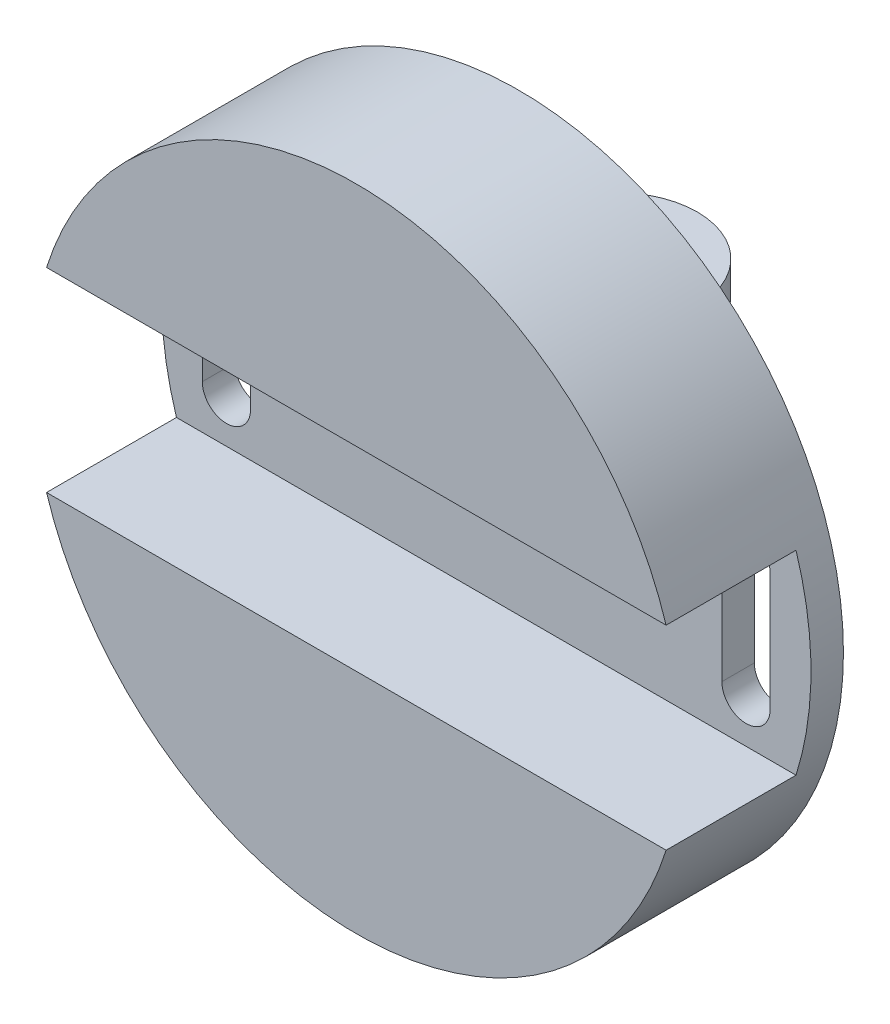
ISO-10303-21;
HEADER;
FILE_DESCRIPTION(('STEP AP214'),'2;1');
FILE_NAME('part.step','',(''),(''),'','','');
FILE_SCHEMA(('AUTOMOTIVE_DESIGN { 1 0 10303 214 1 1 1 1 }'));
ENDSEC;
DATA;
#1=APPLICATION_CONTEXT('core data for automotive mechanical design processes');
#2=APPLICATION_PROTOCOL_DEFINITION('international standard','automotive_design',2000,#1);
#3=PRODUCT_CONTEXT('',#1,'mechanical');
#4=PRODUCT('Part','Part','',(#3));
#5=PRODUCT_RELATED_PRODUCT_CATEGORY('part','',(#4));
#6=PRODUCT_DEFINITION_FORMATION('','',#4);
#7=PRODUCT_DEFINITION_CONTEXT('part definition',#1,'design');
#8=PRODUCT_DEFINITION('design','',#6,#7);
#9=PRODUCT_DEFINITION_SHAPE('','',#8);
#10=(LENGTH_UNIT() NAMED_UNIT(*) SI_UNIT(.MILLI.,.METRE.));
#11=(NAMED_UNIT(*) PLANE_ANGLE_UNIT() SI_UNIT($,.RADIAN.));
#12=(NAMED_UNIT(*) SI_UNIT($,.STERADIAN.) SOLID_ANGLE_UNIT());
#13=UNCERTAINTY_MEASURE_WITH_UNIT(LENGTH_MEASURE(1.E-05),#10,'distance_accuracy_value','');
#14=(GEOMETRIC_REPRESENTATION_CONTEXT(3) GLOBAL_UNCERTAINTY_ASSIGNED_CONTEXT((#13)) GLOBAL_UNIT_ASSIGNED_CONTEXT((#10,
#11,#12)) REPRESENTATION_CONTEXT('',''));
#15=CARTESIAN_POINT('',(0.,0.,0.));
#16=DIRECTION('',(0.,0.,1.));
#17=DIRECTION('',(1.,0.,0.));
#18=AXIS2_PLACEMENT_3D('',#15,#16,#17);
#19=CARTESIAN_POINT('',(0.,0.,25.));
#20=DIRECTION('',(0.,0.,1.));
#21=DIRECTION('',(1.,0.,0.));
#22=AXIS2_PLACEMENT_3D('',#19,#20,#21);
#23=PLANE('',#22);
#24=DIRECTION('',(-1.,0.,0.));
#25=VECTOR('',#24,1.);
#26=CARTESIAN_POINT('',(0.,15.,25.));
#27=LINE('',#26,#25);
#28=CARTESIAN_POINT('',(47.6969600708473,15.,25.));
#29=VERTEX_POINT('',#28);
#30=CARTESIAN_POINT('',(-47.6969600708473,15.,25.));
#31=VERTEX_POINT('',#30);
#32=EDGE_CURVE('E379',#29,#31,#27,.T.);
#33=ORIENTED_EDGE('',*,*,#32,.F.);
#34=CARTESIAN_POINT('',(0.,0.,25.));
#35=DIRECTION('',(0.,0.,1.));
#36=DIRECTION('',(1.,0.,0.));
#37=AXIS2_PLACEMENT_3D('',#34,#35,#36);
#38=CIRCLE('',#37,50.);
#39=EDGE_CURVE('E380',#29,#31,#38,.T.);
#40=ORIENTED_EDGE('',*,*,#39,.T.);
#41=EDGE_LOOP('',(#33,#40));
#42=FACE_BOUND('',#41,.T.);
#43=ADVANCED_FACE('F33',(#42),#23,.T.);
#44=CARTESIAN_POINT('',(0.,0.,0.));
#45=DIRECTION('',(0.,0.,1.));
#46=DIRECTION('',(1.,0.,0.));
#47=AXIS2_PLACEMENT_3D('',#44,#45,#46);
#48=PLANE('',#47);
#49=DIRECTION('',(0.,1.,0.));
#50=VECTOR('',#49,1.);
#51=CARTESIAN_POINT('',(43.7178376318911,0.,0.));
#52=LINE('',#51,#50);
#53=CARTESIAN_POINT('',(43.7178376318911,-8.23235475633024,0.));
#54=VERTEX_POINT('',#53);
#55=CARTESIAN_POINT('',(43.7178376318911,9.95849365685101,0.));
#56=VERTEX_POINT('',#55);
#57=EDGE_CURVE('E248',#54,#56,#52,.T.);
#58=ORIENTED_EDGE('',*,*,#57,.T.);
#59=CARTESIAN_POINT('',(40.,9.95849365685101,0.));
#60=DIRECTION('',(0.,0.,1.));
#61=DIRECTION('',(1.,0.,0.));
#62=AXIS2_PLACEMENT_3D('',#59,#60,#61);
#63=CIRCLE('',#62,3.71783763189105);
#64=CARTESIAN_POINT('',(36.2821623681089,9.95849365685101,0.));
#65=VERTEX_POINT('',#64);
#66=EDGE_CURVE('E251',#56,#65,#63,.T.);
#67=ORIENTED_EDGE('',*,*,#66,.T.);
#68=DIRECTION('',(0.,-1.,0.));
#69=VECTOR('',#68,1.);
#70=CARTESIAN_POINT('',(36.2821623681089,0.,0.));
#71=LINE('',#70,#69);
#72=CARTESIAN_POINT('',(36.2821623681089,-8.23235475633024,0.));
#73=VERTEX_POINT('',#72);
#74=EDGE_CURVE('E243',#65,#73,#71,.T.);
#75=ORIENTED_EDGE('',*,*,#74,.T.);
#76=CARTESIAN_POINT('',(40.,-8.23235475633024,0.));
#77=DIRECTION('',(0.,0.,1.));
#78=DIRECTION('',(1.,0.,0.));
#79=AXIS2_PLACEMENT_3D('',#76,#77,#78);
#80=CIRCLE('',#79,3.71783763189105);
#81=EDGE_CURVE('E223',#73,#54,#80,.T.);
#82=ORIENTED_EDGE('',*,*,#81,.T.);
#83=EDGE_LOOP('',(#58,#67,#75,#82));
#84=FACE_BOUND('',#83,.T.);
#85=DIRECTION('',(0.,1.,0.));
#86=VECTOR('',#85,1.);
#87=CARTESIAN_POINT('',(-36.2821623681089,0.,0.));
#88=LINE('',#87,#86);
#89=CARTESIAN_POINT('',(-36.2821623681089,-8.23235475633024,0.));
#90=VERTEX_POINT('',#89);
#91=CARTESIAN_POINT('',(-36.2821623681089,9.95849365685101,0.));
#92=VERTEX_POINT('',#91);
#93=EDGE_CURVE('E280',#90,#92,#88,.T.);
#94=ORIENTED_EDGE('',*,*,#93,.T.);
#95=CARTESIAN_POINT('',(-40.,9.95849365685101,0.));
#96=DIRECTION('',(0.,0.,1.));
#97=DIRECTION('',(1.,0.,0.));
#98=AXIS2_PLACEMENT_3D('',#95,#96,#97);
#99=CIRCLE('',#98,3.71783763189105);
#100=CARTESIAN_POINT('',(-43.7178376318911,9.95849365685101,0.));
#101=VERTEX_POINT('',#100);
#102=EDGE_CURVE('E283',#92,#101,#99,.T.);
#103=ORIENTED_EDGE('',*,*,#102,.T.);
#104=DIRECTION('',(0.,-1.,0.));
#105=VECTOR('',#104,1.);
#106=CARTESIAN_POINT('',(-43.7178376318911,0.,0.));
#107=LINE('',#106,#105);
#108=CARTESIAN_POINT('',(-43.7178376318911,-8.23235475633024,0.));
#109=VERTEX_POINT('',#108);
#110=EDGE_CURVE('E268',#101,#109,#107,.T.);
#111=ORIENTED_EDGE('',*,*,#110,.T.);
#112=CARTESIAN_POINT('',(-40.,-8.23235475633024,0.));
#113=DIRECTION('',(0.,0.,1.));
#114=DIRECTION('',(1.,0.,0.));
#115=AXIS2_PLACEMENT_3D('',#112,#113,#114);
#116=CIRCLE('',#115,3.71783763189105);
#117=EDGE_CURVE('E277',#109,#90,#116,.T.);
#118=ORIENTED_EDGE('',*,*,#117,.T.);
#119=EDGE_LOOP('',(#94,#103,#111,#118));
#120=FACE_BOUND('',#119,.T.);
#121=DIRECTION('',(0.,-1.,0.));
#122=VECTOR('',#121,1.);
#123=CARTESIAN_POINT('',(12.5,20.,0.));
#124=LINE('',#123,#122);
#125=CARTESIAN_POINT('',(12.5,20.,0.));
#126=VERTEX_POINT('',#125);
#127=CARTESIAN_POINT('',(12.5,15.,0.));
#128=VERTEX_POINT('',#127);
#129=EDGE_CURVE('E349',#126,#128,#124,.T.);
#130=ORIENTED_EDGE('',*,*,#129,.F.);
#131=DIRECTION('',(-1.,0.,0.));
#132=VECTOR('',#131,1.);
#133=CARTESIAN_POINT('',(25.,20.,0.));
#134=LINE('',#133,#132);
#135=CARTESIAN_POINT('',(25.,20.,0.));
#136=VERTEX_POINT('',#135);
#137=EDGE_CURVE('E405',#136,#126,#134,.T.);
#138=ORIENTED_EDGE('',*,*,#137,.F.);
#139=DIRECTION('',(0.,-1.,0.));
#140=VECTOR('',#139,1.);
#141=CARTESIAN_POINT('',(25.,40.,0.));
#142=LINE('',#141,#140);
#143=CARTESIAN_POINT('',(25.,40.,0.));
#144=VERTEX_POINT('',#143);
#145=EDGE_CURVE('E415',#144,#136,#142,.T.);
#146=ORIENTED_EDGE('',*,*,#145,.F.);
#147=DIRECTION('',(1.,0.,0.));
#148=VECTOR('',#147,1.);
#149=CARTESIAN_POINT('',(25.,40.,0.));
#150=LINE('',#149,#148);
#151=CARTESIAN_POINT('',(-25.,40.,0.));
#152=VERTEX_POINT('',#151);
#153=EDGE_CURVE('E420',#152,#144,#150,.T.);
#154=ORIENTED_EDGE('',*,*,#153,.F.);
#155=DIRECTION('',(0.,1.,0.));
#156=VECTOR('',#155,1.);
#157=CARTESIAN_POINT('',(-25.,40.,0.));
#158=LINE('',#157,#156);
#159=CARTESIAN_POINT('',(-25.,20.,0.));
#160=VERTEX_POINT('',#159);
#161=EDGE_CURVE('E409',#160,#152,#158,.T.);
#162=ORIENTED_EDGE('',*,*,#161,.F.);
#163=CARTESIAN_POINT('',(-12.5,20.,0.));
#164=VERTEX_POINT('',#163);
#165=EDGE_CURVE('E410',#164,#160,#134,.T.);
#166=ORIENTED_EDGE('',*,*,#165,.F.);
#167=DIRECTION('',(0.,1.,0.));
#168=VECTOR('',#167,1.);
#169=CARTESIAN_POINT('',(-12.5,20.,0.));
#170=LINE('',#169,#168);
#171=CARTESIAN_POINT('',(-12.5,15.,0.));
#172=VERTEX_POINT('',#171);
#173=EDGE_CURVE('E354',#172,#164,#170,.T.);
#174=ORIENTED_EDGE('',*,*,#173,.F.);
#175=DIRECTION('',(-1.,0.,0.));
#176=VECTOR('',#175,1.);
#177=CARTESIAN_POINT('',(12.5,15.,0.));
#178=LINE('',#177,#176);
#179=EDGE_CURVE('E358',#128,#172,#178,.T.);
#180=ORIENTED_EDGE('',*,*,#179,.F.);
#181=EDGE_LOOP('',(#130,#138,#146,#154,#162,#166,#174,#180));
#182=FACE_BOUND('',#181,.T.);
#183=CARTESIAN_POINT('',(0.,0.,0.));
#184=DIRECTION('',(0.,0.,1.));
#185=DIRECTION('',(1.,0.,0.));
#186=AXIS2_PLACEMENT_3D('',#183,#184,#185);
#187=CIRCLE('',#186,50.);
#188=CARTESIAN_POINT('',(50.,0.,0.));
#189=VERTEX_POINT('',#188);
#190=EDGE_CURVE('E397',#189,#189,#187,.T.);
#191=ORIENTED_EDGE('',*,*,#190,.F.);
#192=EDGE_LOOP('',(#191));
#193=FACE_BOUND('',#192,.T.);
#194=DIRECTION('',(0.,1.,0.));
#195=VECTOR('',#194,1.);
#196=CARTESIAN_POINT('',(-12.4999999999999,-20.,0.));
#197=LINE('',#196,#195);
#198=CARTESIAN_POINT('',(-12.4999999999999,-20.,0.));
#199=VERTEX_POINT('',#198);
#200=CARTESIAN_POINT('',(-12.4999999999999,-15.,0.));
#201=VERTEX_POINT('',#200);
#202=EDGE_CURVE('E324',#199,#201,#197,.T.);
#203=ORIENTED_EDGE('',*,*,#202,.F.);
#204=DIRECTION('',(1.,0.,0.));
#205=VECTOR('',#204,1.);
#206=CARTESIAN_POINT('',(25.,-20.,0.));
#207=LINE('',#206,#205);
#208=CARTESIAN_POINT('',(-25.,-20.,0.));
#209=VERTEX_POINT('',#208);
#210=EDGE_CURVE('E459',#209,#199,#207,.T.);
#211=ORIENTED_EDGE('',*,*,#210,.F.);
#212=DIRECTION('',(0.,1.,0.));
#213=VECTOR('',#212,1.);
#214=CARTESIAN_POINT('',(-25.,-40.,0.));
#215=LINE('',#214,#213);
#216=CARTESIAN_POINT('',(-25.,-40.,0.));
#217=VERTEX_POINT('',#216);
#218=EDGE_CURVE('E464',#217,#209,#215,.T.);
#219=ORIENTED_EDGE('',*,*,#218,.F.);
#220=DIRECTION('',(-1.,0.,0.));
#221=VECTOR('',#220,1.);
#222=CARTESIAN_POINT('',(25.,-40.,0.));
#223=LINE('',#222,#221);
#224=CARTESIAN_POINT('',(25.,-40.,0.));
#225=VERTEX_POINT('',#224);
#226=EDGE_CURVE('E467',#225,#217,#223,.T.);
#227=ORIENTED_EDGE('',*,*,#226,.F.);
#228=DIRECTION('',(0.,-1.,0.));
#229=VECTOR('',#228,1.);
#230=CARTESIAN_POINT('',(25.,-40.,0.));
#231=LINE('',#230,#229);
#232=CARTESIAN_POINT('',(25.,-20.,0.));
#233=VERTEX_POINT('',#232);
#234=EDGE_CURVE('E470',#233,#225,#231,.T.);
#235=ORIENTED_EDGE('',*,*,#234,.F.);
#236=CARTESIAN_POINT('',(12.5,-20.,0.));
#237=VERTEX_POINT('',#236);
#238=EDGE_CURVE('E463',#237,#233,#207,.T.);
#239=ORIENTED_EDGE('',*,*,#238,.F.);
#240=DIRECTION('',(0.,-1.,0.));
#241=VECTOR('',#240,1.);
#242=CARTESIAN_POINT('',(12.5,-20.,0.));
#243=LINE('',#242,#241);
#244=CARTESIAN_POINT('',(12.5,-15.,0.));
#245=VERTEX_POINT('',#244);
#246=EDGE_CURVE('E331',#245,#237,#243,.T.);
#247=ORIENTED_EDGE('',*,*,#246,.F.);
#248=DIRECTION('',(1.,0.,0.));
#249=VECTOR('',#248,1.);
#250=CARTESIAN_POINT('',(12.5,-15.,0.));
#251=LINE('',#250,#249);
#252=EDGE_CURVE('E336',#201,#245,#251,.T.);
#253=ORIENTED_EDGE('',*,*,#252,.F.);
#254=EDGE_LOOP('',(#203,#211,#219,#227,#235,#239,#247,#253));
#255=FACE_BOUND('',#254,.T.);
#256=ADVANCED_FACE('F492',(#84,#120,#182,#193,#255),#48,.F.);
#257=CARTESIAN_POINT('',(0.,0.,25.));
#258=DIRECTION('',(0.,0.,-1.));
#259=DIRECTION('',(-1.,0.,0.));
#260=AXIS2_PLACEMENT_3D('',#257,#258,#259);
#261=CYLINDRICAL_SURFACE('',#260,50.);
#262=CARTESIAN_POINT('',(0.,0.,5.));
#263=DIRECTION('',(0.,0.,1.));
#264=DIRECTION('',(1.,0.,0.));
#265=AXIS2_PLACEMENT_3D('',#262,#263,#264);
#266=CIRCLE('',#265,50.);
#267=CARTESIAN_POINT('',(-47.6969600708473,15.,5.));
#268=VERTEX_POINT('',#267);
#269=CARTESIAN_POINT('',(-47.6969600708473,-15.,5.));
#270=VERTEX_POINT('',#269);
#271=EDGE_CURVE('E11',#268,#270,#266,.T.);
#272=ORIENTED_EDGE('',*,*,#271,.F.);
#273=DIRECTION('',(0.,0.,-1.));
#274=VECTOR('',#273,1.);
#275=CARTESIAN_POINT('',(-47.6969600708473,15.,25.));
#276=LINE('',#275,#274);
#277=EDGE_CURVE('E298',#268,#31,#276,.F.);
#278=ORIENTED_EDGE('',*,*,#277,.T.);
#279=ORIENTED_EDGE('',*,*,#39,.F.);
#280=DIRECTION('',(0.,0.,-1.));
#281=VECTOR('',#280,1.);
#282=CARTESIAN_POINT('',(47.6969600708473,15.,25.));
#283=LINE('',#282,#281);
#284=CARTESIAN_POINT('',(47.6969600708473,15.,5.));
#285=VERTEX_POINT('',#284);
#286=EDGE_CURVE('E301',#29,#285,#283,.T.);
#287=ORIENTED_EDGE('',*,*,#286,.T.);
#288=CARTESIAN_POINT('',(47.6969600708473,-15.,5.));
#289=VERTEX_POINT('',#288);
#290=EDGE_CURVE('E37',#289,#285,#266,.T.);
#291=ORIENTED_EDGE('',*,*,#290,.F.);
#292=DIRECTION('',(0.,0.,-1.));
#293=VECTOR('',#292,1.);
#294=CARTESIAN_POINT('',(47.6969600708473,-15.,25.));
#295=LINE('',#294,#293);
#296=CARTESIAN_POINT('',(47.6969600708473,-15.,25.));
#297=VERTEX_POINT('',#296);
#298=EDGE_CURVE('E292',#289,#297,#295,.F.);
#299=ORIENTED_EDGE('',*,*,#298,.T.);
#300=CARTESIAN_POINT('',(-47.6969600708473,-15.,25.));
#301=VERTEX_POINT('',#300);
#302=EDGE_CURVE('E394',#301,#297,#38,.T.);
#303=ORIENTED_EDGE('',*,*,#302,.F.);
#304=DIRECTION('',(0.,0.,-1.));
#305=VECTOR('',#304,1.);
#306=CARTESIAN_POINT('',(-47.6969600708473,-15.,25.));
#307=LINE('',#306,#305);
#308=EDGE_CURVE('E295',#301,#270,#307,.T.);
#309=ORIENTED_EDGE('',*,*,#308,.T.);
#310=EDGE_LOOP('',(#272,#278,#279,#287,#291,#299,#303,#309));
#311=FACE_BOUND('',#310,.T.);
#312=ORIENTED_EDGE('',*,*,#190,.T.);
#313=EDGE_LOOP('',(#312));
#314=FACE_BOUND('',#313,.T.);
#315=ADVANCED_FACE('F35',(#311,#314),#261,.T.);
#316=DIRECTION('',(1.,0.,0.));
#317=VECTOR('',#316,1.);
#318=CARTESIAN_POINT('',(0.,-15.,25.));
#319=LINE('',#318,#317);
#320=EDGE_CURVE('E378',#301,#297,#319,.T.);
#321=ORIENTED_EDGE('',*,*,#320,.F.);
#322=ORIENTED_EDGE('',*,*,#302,.T.);
#323=EDGE_LOOP('',(#321,#322));
#324=FACE_BOUND('',#323,.T.);
#325=ADVANCED_FACE('F525',(#324),#23,.T.);
#326=CARTESIAN_POINT('',(25.,40.,20.));
#327=DIRECTION('',(1.,0.,0.));
#328=DIRECTION('',(0.,1.,0.));
#329=AXIS2_PLACEMENT_3D('',#326,#327,#328);
#330=PLANE('',#329);
#331=ORIENTED_EDGE('',*,*,#145,.T.);
#332=DIRECTION('',(0.,0.,-1.));
#333=VECTOR('',#332,1.);
#334=CARTESIAN_POINT('',(25.,20.,20.));
#335=LINE('',#334,#333);
#336=CARTESIAN_POINT('',(25.,20.,20.));
#337=VERTEX_POINT('',#336);
#338=EDGE_CURVE('E400',#337,#136,#335,.T.);
#339=ORIENTED_EDGE('',*,*,#338,.F.);
#340=DIRECTION('',(0.,-1.,0.));
#341=VECTOR('',#340,1.);
#342=CARTESIAN_POINT('',(25.,40.,20.));
#343=LINE('',#342,#341);
#344=CARTESIAN_POINT('',(25.,40.,20.));
#345=VERTEX_POINT('',#344);
#346=EDGE_CURVE('E423',#345,#337,#343,.T.);
#347=ORIENTED_EDGE('',*,*,#346,.F.);
#348=DIRECTION('',(0.,0.,-1.));
#349=VECTOR('',#348,1.);
#350=CARTESIAN_POINT('',(25.,40.,20.));
#351=LINE('',#350,#349);
#352=EDGE_CURVE('E404',#345,#144,#351,.T.);
#353=ORIENTED_EDGE('',*,*,#352,.T.);
#354=EDGE_LOOP('',(#331,#339,#347,#353));
#355=FACE_BOUND('',#354,.T.);
#356=ADVANCED_FACE('F497',(#355),#330,.F.);
#357=CARTESIAN_POINT('',(25.,40.,20.));
#358=DIRECTION('',(0.,1.,0.));
#359=DIRECTION('',(0.,0.,1.));
#360=AXIS2_PLACEMENT_3D('',#357,#358,#359);
#361=PLANE('',#360);
#362=ORIENTED_EDGE('',*,*,#153,.T.);
#363=ORIENTED_EDGE('',*,*,#352,.F.);
#364=DIRECTION('',(1.,0.,0.));
#365=VECTOR('',#364,1.);
#366=CARTESIAN_POINT('',(25.,40.,20.));
#367=LINE('',#366,#365);
#368=CARTESIAN_POINT('',(-25.,40.,20.));
#369=VERTEX_POINT('',#368);
#370=EDGE_CURVE('E432',#369,#345,#367,.T.);
#371=ORIENTED_EDGE('',*,*,#370,.F.);
#372=DIRECTION('',(0.,0.,-1.));
#373=VECTOR('',#372,1.);
#374=CARTESIAN_POINT('',(-25.,40.,20.));
#375=LINE('',#374,#373);
#376=EDGE_CURVE('E425',#369,#152,#375,.T.);
#377=ORIENTED_EDGE('',*,*,#376,.T.);
#378=EDGE_LOOP('',(#362,#363,#371,#377));
#379=FACE_BOUND('',#378,.T.);
#380=ADVANCED_FACE('F537',(#379),#361,.F.);
#381=CARTESIAN_POINT('',(-25.,40.,20.));
#382=DIRECTION('',(-1.,0.,0.));
#383=DIRECTION('',(0.,-1.,0.));
#384=AXIS2_PLACEMENT_3D('',#381,#382,#383);
#385=PLANE('',#384);
#386=ORIENTED_EDGE('',*,*,#161,.T.);
#387=ORIENTED_EDGE('',*,*,#376,.F.);
#388=DIRECTION('',(0.,1.,0.));
#389=VECTOR('',#388,1.);
#390=CARTESIAN_POINT('',(-25.,40.,20.));
#391=LINE('',#390,#389);
#392=CARTESIAN_POINT('',(-25.,20.,20.));
#393=VERTEX_POINT('',#392);
#394=EDGE_CURVE('E437',#393,#369,#391,.T.);
#395=ORIENTED_EDGE('',*,*,#394,.F.);
#396=DIRECTION('',(0.,0.,-1.));
#397=VECTOR('',#396,1.);
#398=CARTESIAN_POINT('',(-25.,20.,20.));
#399=LINE('',#398,#397);
#400=EDGE_CURVE('E426',#393,#160,#399,.T.);
#401=ORIENTED_EDGE('',*,*,#400,.T.);
#402=EDGE_LOOP('',(#386,#387,#395,#401));
#403=FACE_BOUND('',#402,.T.);
#404=ADVANCED_FACE('F691',(#403),#385,.F.);
#405=CARTESIAN_POINT('',(25.,20.,20.));
#406=DIRECTION('',(0.,-1.,0.));
#407=DIRECTION('',(0.,0.,-1.));
#408=AXIS2_PLACEMENT_3D('',#405,#406,#407);
#409=PLANE('',#408);
#410=CARTESIAN_POINT('',(0.,20.,-12.5));
#411=DIRECTION('',(0.,1.,0.));
#412=DIRECTION('',(0.,0.,1.));
#413=AXIS2_PLACEMENT_3D('',#410,#411,#412);
#414=CIRCLE('',#413,2.5);
#415=CARTESIAN_POINT('',(0.,20.,-10.));
#416=VERTEX_POINT('',#415);
#417=EDGE_CURVE('E304',#416,#416,#414,.T.);
#418=ORIENTED_EDGE('',*,*,#417,.F.);
#419=EDGE_LOOP('',(#418));
#420=FACE_BOUND('',#419,.T.);
#421=ORIENTED_EDGE('',*,*,#137,.T.);
#422=DIRECTION('',(0.,0.,1.));
#423=VECTOR('',#422,1.);
#424=CARTESIAN_POINT('',(12.5,20.,-15.));
#425=LINE('',#424,#423);
#426=CARTESIAN_POINT('',(12.5,20.,-15.));
#427=VERTEX_POINT('',#426);
#428=EDGE_CURVE('E357',#427,#126,#425,.T.);
#429=ORIENTED_EDGE('',*,*,#428,.F.);
#430=CARTESIAN_POINT('',(0.,20.,-15.));
#431=DIRECTION('',(0.,-1.,0.));
#432=DIRECTION('',(0.,0.,-1.));
#433=AXIS2_PLACEMENT_3D('',#430,#431,#432);
#434=CIRCLE('',#433,12.5);
#435=CARTESIAN_POINT('',(-12.5,20.,-15.));
#436=VERTEX_POINT('',#435);
#437=EDGE_CURVE('E314',#436,#427,#434,.T.);
#438=ORIENTED_EDGE('',*,*,#437,.F.);
#439=DIRECTION('',(0.,0.,1.));
#440=VECTOR('',#439,1.);
#441=CARTESIAN_POINT('',(-12.5,20.,-15.));
#442=LINE('',#441,#440);
#443=EDGE_CURVE('E371',#436,#164,#442,.T.);
#444=ORIENTED_EDGE('',*,*,#443,.T.);
#445=ORIENTED_EDGE('',*,*,#165,.T.);
#446=ORIENTED_EDGE('',*,*,#400,.F.);
#447=DIRECTION('',(-1.,0.,0.));
#448=VECTOR('',#447,1.);
#449=CARTESIAN_POINT('',(25.,20.,20.));
#450=LINE('',#449,#448);
#451=EDGE_CURVE('E442',#337,#393,#450,.T.);
#452=ORIENTED_EDGE('',*,*,#451,.F.);
#453=ORIENTED_EDGE('',*,*,#338,.T.);
#454=EDGE_LOOP('',(#421,#429,#438,#444,#445,#446,#452,#453));
#455=FACE_BOUND('',#454,.T.);
#456=ADVANCED_FACE('F501',(#420,#455),#409,.F.);
#457=CARTESIAN_POINT('',(0.,0.,20.));
#458=DIRECTION('',(0.,0.,-1.));
#459=DIRECTION('',(-1.,0.,0.));
#460=AXIS2_PLACEMENT_3D('',#457,#458,#459);
#461=PLANE('',#460);
#462=ORIENTED_EDGE('',*,*,#346,.T.);
#463=ORIENTED_EDGE('',*,*,#451,.T.);
#464=ORIENTED_EDGE('',*,*,#394,.T.);
#465=ORIENTED_EDGE('',*,*,#370,.T.);
#466=EDGE_LOOP('',(#462,#463,#464,#465));
#467=FACE_BOUND('',#466,.T.);
#468=ADVANCED_FACE('F690',(#467),#461,.T.);
#469=CARTESIAN_POINT('',(25.,-40.,20.));
#470=DIRECTION('',(1.,0.,0.));
#471=DIRECTION('',(0.,1.,0.));
#472=AXIS2_PLACEMENT_3D('',#469,#470,#471);
#473=PLANE('',#472);
#474=ORIENTED_EDGE('',*,*,#234,.T.);
#475=DIRECTION('',(0.,0.,-1.));
#476=VECTOR('',#475,1.);
#477=CARTESIAN_POINT('',(25.,-40.,20.));
#478=LINE('',#477,#476);
#479=CARTESIAN_POINT('',(25.,-40.,20.));
#480=VERTEX_POINT('',#479);
#481=EDGE_CURVE('E448',#480,#225,#478,.T.);
#482=ORIENTED_EDGE('',*,*,#481,.F.);
#483=DIRECTION('',(0.,-1.,0.));
#484=VECTOR('',#483,1.);
#485=CARTESIAN_POINT('',(25.,-40.,20.));
#486=LINE('',#485,#484);
#487=CARTESIAN_POINT('',(25.,-20.,20.));
#488=VERTEX_POINT('',#487);
#489=EDGE_CURVE('E462',#488,#480,#486,.T.);
#490=ORIENTED_EDGE('',*,*,#489,.F.);
#491=DIRECTION('',(0.,0.,-1.));
#492=VECTOR('',#491,1.);
#493=CARTESIAN_POINT('',(25.,-20.,20.));
#494=LINE('',#493,#492);
#495=EDGE_CURVE('E456',#488,#233,#494,.T.);
#496=ORIENTED_EDGE('',*,*,#495,.T.);
#497=EDGE_LOOP('',(#474,#482,#490,#496));
#498=FACE_BOUND('',#497,.T.);
#499=ADVANCED_FACE('F726',(#498),#473,.F.);
#500=CARTESIAN_POINT('',(25.,-20.,20.));
#501=DIRECTION('',(0.,1.,0.));
#502=DIRECTION('',(0.,0.,1.));
#503=AXIS2_PLACEMENT_3D('',#500,#501,#502);
#504=PLANE('',#503);
#505=CARTESIAN_POINT('',(0.,-20.,-12.5));
#506=DIRECTION('',(0.,1.,0.));
#507=DIRECTION('',(0.,0.,1.));
#508=AXIS2_PLACEMENT_3D('',#505,#506,#507);
#509=CIRCLE('',#508,2.5);
#510=CARTESIAN_POINT('',(0.,-20.,-10.));
#511=VERTEX_POINT('',#510);
#512=EDGE_CURVE('E311',#511,#511,#509,.T.);
#513=ORIENTED_EDGE('',*,*,#512,.T.);
#514=EDGE_LOOP('',(#513));
#515=FACE_BOUND('',#514,.T.);
#516=ORIENTED_EDGE('',*,*,#210,.T.);
#517=DIRECTION('',(0.,0.,1.));
#518=VECTOR('',#517,1.);
#519=CARTESIAN_POINT('',(-12.4999999999999,-20.,-15.));
#520=LINE('',#519,#518);
#521=CARTESIAN_POINT('',(-12.4999999999999,-20.,-15.));
#522=VERTEX_POINT('',#521);
#523=EDGE_CURVE('E347',#522,#199,#520,.T.);
#524=ORIENTED_EDGE('',*,*,#523,.F.);
#525=CARTESIAN_POINT('',(0.,-20.,-15.));
#526=DIRECTION('',(0.,-1.,0.));
#527=DIRECTION('',(0.,0.,-1.));
#528=AXIS2_PLACEMENT_3D('',#525,#526,#527);
#529=CIRCLE('',#528,12.5);
#530=CARTESIAN_POINT('',(12.5,-20.,-15.));
#531=VERTEX_POINT('',#530);
#532=EDGE_CURVE('E318',#522,#531,#529,.T.);
#533=ORIENTED_EDGE('',*,*,#532,.T.);
#534=DIRECTION('',(0.,0.,1.));
#535=VECTOR('',#534,1.);
#536=CARTESIAN_POINT('',(12.5,-20.,-15.));
#537=LINE('',#536,#535);
#538=EDGE_CURVE('E334',#531,#237,#537,.T.);
#539=ORIENTED_EDGE('',*,*,#538,.T.);
#540=ORIENTED_EDGE('',*,*,#238,.T.);
#541=ORIENTED_EDGE('',*,*,#495,.F.);
#542=DIRECTION('',(1.,0.,0.));
#543=VECTOR('',#542,1.);
#544=CARTESIAN_POINT('',(25.,-20.,20.));
#545=LINE('',#544,#543);
#546=CARTESIAN_POINT('',(-25.,-20.,20.));
#547=VERTEX_POINT('',#546);
#548=EDGE_CURVE('E452',#547,#488,#545,.T.);
#549=ORIENTED_EDGE('',*,*,#548,.F.);
#550=DIRECTION('',(0.,0.,-1.));
#551=VECTOR('',#550,1.);
#552=CARTESIAN_POINT('',(-25.,-20.,20.));
#553=LINE('',#552,#551);
#554=EDGE_CURVE('E454',#547,#209,#553,.T.);
#555=ORIENTED_EDGE('',*,*,#554,.T.);
#556=EDGE_LOOP('',(#516,#524,#533,#539,#540,#541,#549,#555));
#557=FACE_BOUND('',#556,.T.);
#558=ADVANCED_FACE('F721',(#515,#557),#504,.F.);
#559=CARTESIAN_POINT('',(-25.,-40.,20.));
#560=DIRECTION('',(-1.,0.,0.));
#561=DIRECTION('',(0.,-1.,0.));
#562=AXIS2_PLACEMENT_3D('',#559,#560,#561);
#563=PLANE('',#562);
#564=ORIENTED_EDGE('',*,*,#218,.T.);
#565=ORIENTED_EDGE('',*,*,#554,.F.);
#566=DIRECTION('',(0.,1.,0.));
#567=VECTOR('',#566,1.);
#568=CARTESIAN_POINT('',(-25.,-40.,20.));
#569=LINE('',#568,#567);
#570=CARTESIAN_POINT('',(-25.,-40.,20.));
#571=VERTEX_POINT('',#570);
#572=EDGE_CURVE('E475',#571,#547,#569,.T.);
#573=ORIENTED_EDGE('',*,*,#572,.F.);
#574=DIRECTION('',(0.,0.,-1.));
#575=VECTOR('',#574,1.);
#576=CARTESIAN_POINT('',(-25.,-40.,20.));
#577=LINE('',#576,#575);
#578=EDGE_CURVE('E451',#571,#217,#577,.T.);
#579=ORIENTED_EDGE('',*,*,#578,.T.);
#580=EDGE_LOOP('',(#564,#565,#573,#579));
#581=FACE_BOUND('',#580,.T.);
#582=ADVANCED_FACE('F725',(#581),#563,.F.);
#583=CARTESIAN_POINT('',(25.,-40.,20.));
#584=DIRECTION('',(0.,-1.,0.));
#585=DIRECTION('',(0.,0.,-1.));
#586=AXIS2_PLACEMENT_3D('',#583,#584,#585);
#587=PLANE('',#586);
#588=ORIENTED_EDGE('',*,*,#226,.T.);
#589=ORIENTED_EDGE('',*,*,#578,.F.);
#590=DIRECTION('',(-1.,0.,0.));
#591=VECTOR('',#590,1.);
#592=CARTESIAN_POINT('',(25.,-40.,20.));
#593=LINE('',#592,#591);
#594=EDGE_CURVE('E478',#480,#571,#593,.T.);
#595=ORIENTED_EDGE('',*,*,#594,.F.);
#596=ORIENTED_EDGE('',*,*,#481,.T.);
#597=EDGE_LOOP('',(#588,#589,#595,#596));
#598=FACE_BOUND('',#597,.T.);
#599=ADVANCED_FACE('F755',(#598),#587,.F.);
#600=CARTESIAN_POINT('',(0.,0.,20.));
#601=DIRECTION('',(0.,0.,1.));
#602=DIRECTION('',(1.,0.,0.));
#603=AXIS2_PLACEMENT_3D('',#600,#601,#602);
#604=PLANE('',#603);
#605=ORIENTED_EDGE('',*,*,#489,.T.);
#606=ORIENTED_EDGE('',*,*,#594,.T.);
#607=ORIENTED_EDGE('',*,*,#572,.T.);
#608=ORIENTED_EDGE('',*,*,#548,.T.);
#609=EDGE_LOOP('',(#605,#606,#607,#608));
#610=FACE_BOUND('',#609,.T.);
#611=ADVANCED_FACE('F750',(#610),#604,.F.);
#612=CARTESIAN_POINT('',(12.5,20.,-15.));
#613=DIRECTION('',(-1.,0.,0.));
#614=DIRECTION('',(0.,0.,1.));
#615=AXIS2_PLACEMENT_3D('',#612,#613,#614);
#616=PLANE('',#615);
#617=ORIENTED_EDGE('',*,*,#129,.T.);
#618=DIRECTION('',(0.,0.,1.));
#619=VECTOR('',#618,1.);
#620=CARTESIAN_POINT('',(12.5,15.,-15.));
#621=LINE('',#620,#619);
#622=CARTESIAN_POINT('',(12.5,15.,-15.));
#623=VERTEX_POINT('',#622);
#624=EDGE_CURVE('E472',#623,#128,#621,.T.);
#625=ORIENTED_EDGE('',*,*,#624,.F.);
#626=DIRECTION('',(0.,-1.,0.));
#627=VECTOR('',#626,1.);
#628=CARTESIAN_POINT('',(12.5,20.,-15.));
#629=LINE('',#628,#627);
#630=EDGE_CURVE('E350',#427,#623,#629,.T.);
#631=ORIENTED_EDGE('',*,*,#630,.F.);
#632=ORIENTED_EDGE('',*,*,#428,.T.);
#633=EDGE_LOOP('',(#617,#625,#631,#632));
#634=FACE_BOUND('',#633,.T.);
#635=ADVANCED_FACE('F504',(#634),#616,.F.);
#636=CARTESIAN_POINT('',(12.5,15.,-15.));
#637=DIRECTION('',(0.,1.,0.));
#638=DIRECTION('',(0.,0.,1.));
#639=AXIS2_PLACEMENT_3D('',#636,#637,#638);
#640=PLANE('',#639);
#641=CARTESIAN_POINT('',(0.,15.,-12.5));
#642=DIRECTION('',(0.,1.,0.));
#643=DIRECTION('',(0.,0.,1.));
#644=AXIS2_PLACEMENT_3D('',#641,#642,#643);
#645=CIRCLE('',#644,2.5);
#646=CARTESIAN_POINT('',(0.,15.,-10.));
#647=VERTEX_POINT('',#646);
#648=EDGE_CURVE('E308',#647,#647,#645,.T.);
#649=ORIENTED_EDGE('',*,*,#648,.T.);
#650=EDGE_LOOP('',(#649));
#651=FACE_BOUND('',#650,.T.);
#652=ORIENTED_EDGE('',*,*,#179,.T.);
#653=DIRECTION('',(0.,0.,1.));
#654=VECTOR('',#653,1.);
#655=CARTESIAN_POINT('',(-12.5,15.,-15.));
#656=LINE('',#655,#654);
#657=CARTESIAN_POINT('',(-12.5,15.,-15.));
#658=VERTEX_POINT('',#657);
#659=EDGE_CURVE('E363',#658,#172,#656,.T.);
#660=ORIENTED_EDGE('',*,*,#659,.F.);
#661=CARTESIAN_POINT('',(0.,15.,-15.));
#662=DIRECTION('',(0.,-1.,0.));
#663=DIRECTION('',(0.,0.,-1.));
#664=AXIS2_PLACEMENT_3D('',#661,#662,#663);
#665=CIRCLE('',#664,12.5);
#666=EDGE_CURVE('E315',#658,#623,#665,.T.);
#667=ORIENTED_EDGE('',*,*,#666,.T.);
#668=ORIENTED_EDGE('',*,*,#624,.T.);
#669=EDGE_LOOP('',(#652,#660,#667,#668));
#670=FACE_BOUND('',#669,.T.);
#671=ADVANCED_FACE('F490',(#651,#670),#640,.F.);
#672=CARTESIAN_POINT('',(-12.5,20.,-15.));
#673=DIRECTION('',(1.,0.,0.));
#674=DIRECTION('',(0.,0.,-1.));
#675=AXIS2_PLACEMENT_3D('',#672,#673,#674);
#676=PLANE('',#675);
#677=ORIENTED_EDGE('',*,*,#173,.T.);
#678=ORIENTED_EDGE('',*,*,#443,.F.);
#679=DIRECTION('',(0.,1.,0.));
#680=VECTOR('',#679,1.);
#681=CARTESIAN_POINT('',(-12.5,20.,-15.));
#682=LINE('',#681,#680);
#683=EDGE_CURVE('E353',#658,#436,#682,.T.);
#684=ORIENTED_EDGE('',*,*,#683,.F.);
#685=ORIENTED_EDGE('',*,*,#659,.T.);
#686=EDGE_LOOP('',(#677,#678,#684,#685));
#687=FACE_BOUND('',#686,.T.);
#688=ADVANCED_FACE('F488',(#687),#676,.F.);
#689=CARTESIAN_POINT('',(-12.4999999999999,-20.,-15.));
#690=DIRECTION('',(1.,0.,0.));
#691=DIRECTION('',(0.,0.,-1.));
#692=AXIS2_PLACEMENT_3D('',#689,#690,#691);
#693=PLANE('',#692);
#694=ORIENTED_EDGE('',*,*,#202,.T.);
#695=DIRECTION('',(0.,0.,1.));
#696=VECTOR('',#695,1.);
#697=CARTESIAN_POINT('',(-12.4999999999999,-15.,-15.));
#698=LINE('',#697,#696);
#699=CARTESIAN_POINT('',(-12.4999999999999,-15.,-15.));
#700=VERTEX_POINT('',#699);
#701=EDGE_CURVE('E344',#700,#201,#698,.T.);
#702=ORIENTED_EDGE('',*,*,#701,.F.);
#703=DIRECTION('',(0.,1.,0.));
#704=VECTOR('',#703,1.);
#705=CARTESIAN_POINT('',(-12.4999999999999,-20.,-15.));
#706=LINE('',#705,#704);
#707=EDGE_CURVE('E327',#522,#700,#706,.T.);
#708=ORIENTED_EDGE('',*,*,#707,.F.);
#709=ORIENTED_EDGE('',*,*,#523,.T.);
#710=EDGE_LOOP('',(#694,#702,#708,#709));
#711=FACE_BOUND('',#710,.T.);
#712=ADVANCED_FACE('F713',(#711),#693,.F.);
#713=CARTESIAN_POINT('',(12.5,-15.,-15.));
#714=DIRECTION('',(0.,-1.,0.));
#715=DIRECTION('',(0.,0.,-1.));
#716=AXIS2_PLACEMENT_3D('',#713,#714,#715);
#717=PLANE('',#716);
#718=CARTESIAN_POINT('',(0.,-15.,-12.5));
#719=DIRECTION('',(0.,-1.,0.));
#720=DIRECTION('',(0.,0.,-1.));
#721=AXIS2_PLACEMENT_3D('',#718,#719,#720);
#722=CIRCLE('',#721,2.5);
#723=CARTESIAN_POINT('',(0.,-15.,-15.));
#724=VERTEX_POINT('',#723);
#725=EDGE_CURVE('E307',#724,#724,#722,.T.);
#726=ORIENTED_EDGE('',*,*,#725,.T.);
#727=EDGE_LOOP('',(#726));
#728=FACE_BOUND('',#727,.T.);
#729=ORIENTED_EDGE('',*,*,#252,.T.);
#730=DIRECTION('',(0.,0.,1.));
#731=VECTOR('',#730,1.);
#732=CARTESIAN_POINT('',(12.5,-15.,-15.));
#733=LINE('',#732,#731);
#734=CARTESIAN_POINT('',(12.5,-15.,-15.));
#735=VERTEX_POINT('',#734);
#736=EDGE_CURVE('E341',#735,#245,#733,.T.);
#737=ORIENTED_EDGE('',*,*,#736,.F.);
#738=CARTESIAN_POINT('',(0.,-15.,-15.));
#739=DIRECTION('',(0.,-1.,0.));
#740=DIRECTION('',(0.,0.,-1.));
#741=AXIS2_PLACEMENT_3D('',#738,#739,#740);
#742=CIRCLE('',#741,12.5);
#743=EDGE_CURVE('E321',#700,#735,#742,.T.);
#744=ORIENTED_EDGE('',*,*,#743,.F.);
#745=ORIENTED_EDGE('',*,*,#701,.T.);
#746=EDGE_LOOP('',(#729,#737,#744,#745));
#747=FACE_BOUND('',#746,.T.);
#748=ADVANCED_FACE('F707',(#728,#747),#717,.F.);
#749=CARTESIAN_POINT('',(12.5,-20.,-15.));
#750=DIRECTION('',(-1.,0.,0.));
#751=DIRECTION('',(0.,0.,1.));
#752=AXIS2_PLACEMENT_3D('',#749,#750,#751);
#753=PLANE('',#752);
#754=ORIENTED_EDGE('',*,*,#246,.T.);
#755=ORIENTED_EDGE('',*,*,#538,.F.);
#756=DIRECTION('',(0.,-1.,0.));
#757=VECTOR('',#756,1.);
#758=CARTESIAN_POINT('',(12.5,-20.,-15.));
#759=LINE('',#758,#757);
#760=EDGE_CURVE('E330',#735,#531,#759,.T.);
#761=ORIENTED_EDGE('',*,*,#760,.F.);
#762=ORIENTED_EDGE('',*,*,#736,.T.);
#763=EDGE_LOOP('',(#754,#755,#761,#762));
#764=FACE_BOUND('',#763,.T.);
#765=ADVANCED_FACE('F520',(#764),#753,.F.);
#766=CARTESIAN_POINT('',(0.,-15.,-15.));
#767=DIRECTION('',(0.,-1.,0.));
#768=DIRECTION('',(0.,0.,-1.));
#769=AXIS2_PLACEMENT_3D('',#766,#767,#768);
#770=CYLINDRICAL_SURFACE('',#769,12.5);
#771=ORIENTED_EDGE('',*,*,#532,.F.);
#772=ORIENTED_EDGE('',*,*,#707,.T.);
#773=ORIENTED_EDGE('',*,*,#743,.T.);
#774=ORIENTED_EDGE('',*,*,#760,.T.);
#775=EDGE_LOOP('',(#771,#772,#773,#774));
#776=FACE_BOUND('',#775,.T.);
#777=ADVANCED_FACE('F511',(#776),#770,.T.);
#778=CARTESIAN_POINT('',(0.,15.,-15.));
#779=DIRECTION('',(0.,1.,0.));
#780=DIRECTION('',(0.,0.,1.));
#781=AXIS2_PLACEMENT_3D('',#778,#779,#780);
#782=CYLINDRICAL_SURFACE('',#781,12.5);
#783=ORIENTED_EDGE('',*,*,#437,.T.);
#784=ORIENTED_EDGE('',*,*,#630,.T.);
#785=ORIENTED_EDGE('',*,*,#666,.F.);
#786=ORIENTED_EDGE('',*,*,#683,.T.);
#787=EDGE_LOOP('',(#783,#784,#785,#786));
#788=FACE_BOUND('',#787,.T.);
#789=ADVANCED_FACE('F508',(#788),#782,.T.);
#790=CARTESIAN_POINT('',(0.,-50.,-12.5));
#791=DIRECTION('',(0.,1.,0.));
#792=DIRECTION('',(0.,0.,1.));
#793=AXIS2_PLACEMENT_3D('',#790,#791,#792);
#794=CYLINDRICAL_SURFACE('',#793,2.5);
#795=ORIENTED_EDGE('',*,*,#725,.F.);
#796=EDGE_LOOP('',(#795));
#797=FACE_BOUND('',#796,.T.);
#798=ORIENTED_EDGE('',*,*,#512,.F.);
#799=EDGE_LOOP('',(#798));
#800=FACE_BOUND('',#799,.T.);
#801=ADVANCED_FACE('F510',(#797,#800),#794,.F.);
#802=ORIENTED_EDGE('',*,*,#417,.T.);
#803=EDGE_LOOP('',(#802));
#804=FACE_BOUND('',#803,.T.);
#805=ORIENTED_EDGE('',*,*,#648,.F.);
#806=EDGE_LOOP('',(#805));
#807=FACE_BOUND('',#806,.T.);
#808=ADVANCED_FACE('F517',(#804,#807),#794,.F.);
#809=CARTESIAN_POINT('',(0.,0.,5.));
#810=DIRECTION('',(0.,0.,1.));
#811=DIRECTION('',(1.,0.,0.));
#812=AXIS2_PLACEMENT_3D('',#809,#810,#811);
#813=PLANE('',#812);
#814=CARTESIAN_POINT('',(40.,9.95849365685101,5.));
#815=DIRECTION('',(0.,0.,1.));
#816=DIRECTION('',(-1.,0.,0.));
#817=AXIS2_PLACEMENT_3D('',#814,#815,#816);
#818=CIRCLE('',#817,3.71783763189105);
#819=CARTESIAN_POINT('',(43.7178376318911,9.95849365685101,5.));
#820=VERTEX_POINT('',#819);
#821=CARTESIAN_POINT('',(36.2821623681089,9.95849365685101,5.));
#822=VERTEX_POINT('',#821);
#823=EDGE_CURVE('E56',#820,#822,#818,.T.);
#824=ORIENTED_EDGE('',*,*,#823,.F.);
#825=DIRECTION('',(0.,1.,0.));
#826=VECTOR('',#825,1.);
#827=CARTESIAN_POINT('',(43.7178376318911,9.95849365685101,5.));
#828=LINE('',#827,#826);
#829=CARTESIAN_POINT('',(43.7178376318911,-8.23235475633024,5.));
#830=VERTEX_POINT('',#829);
#831=EDGE_CURVE('E236',#830,#820,#828,.T.);
#832=ORIENTED_EDGE('',*,*,#831,.F.);
#833=CARTESIAN_POINT('',(40.,-8.23235475633024,5.));
#834=DIRECTION('',(0.,0.,1.));
#835=DIRECTION('',(-1.,0.,0.));
#836=AXIS2_PLACEMENT_3D('',#833,#834,#835);
#837=CIRCLE('',#836,3.71783763189105);
#838=CARTESIAN_POINT('',(36.2821623681089,-8.23235475633024,5.));
#839=VERTEX_POINT('',#838);
#840=EDGE_CURVE('E220',#839,#830,#837,.T.);
#841=ORIENTED_EDGE('',*,*,#840,.F.);
#842=DIRECTION('',(0.,-1.,0.));
#843=VECTOR('',#842,1.);
#844=CARTESIAN_POINT('',(36.2821623681089,9.95849365685101,5.));
#845=LINE('',#844,#843);
#846=EDGE_CURVE('E229',#822,#839,#845,.T.);
#847=ORIENTED_EDGE('',*,*,#846,.F.);
#848=EDGE_LOOP('',(#824,#832,#841,#847));
#849=FACE_BOUND('',#848,.T.);
#850=CARTESIAN_POINT('',(-40.,9.95849365685101,5.));
#851=DIRECTION('',(0.,0.,1.));
#852=DIRECTION('',(1.,0.,0.));
#853=AXIS2_PLACEMENT_3D('',#850,#851,#852);
#854=CIRCLE('',#853,3.71783763189105);
#855=CARTESIAN_POINT('',(-36.2821623681089,9.95849365685101,5.));
#856=VERTEX_POINT('',#855);
#857=CARTESIAN_POINT('',(-43.7178376318911,9.95849365685101,5.));
#858=VERTEX_POINT('',#857);
#859=EDGE_CURVE('E254',#856,#858,#854,.T.);
#860=ORIENTED_EDGE('',*,*,#859,.F.);
#861=DIRECTION('',(0.,1.,0.));
#862=VECTOR('',#861,1.);
#863=CARTESIAN_POINT('',(-36.2821623681089,9.95849365685101,5.));
#864=LINE('',#863,#862);
#865=CARTESIAN_POINT('',(-36.2821623681089,-8.23235475633024,5.));
#866=VERTEX_POINT('',#865);
#867=EDGE_CURVE('E262',#866,#856,#864,.T.);
#868=ORIENTED_EDGE('',*,*,#867,.F.);
#869=CARTESIAN_POINT('',(-40.,-8.23235475633024,5.));
#870=DIRECTION('',(0.,0.,1.));
#871=DIRECTION('',(1.,0.,0.));
#872=AXIS2_PLACEMENT_3D('',#869,#870,#871);
#873=CIRCLE('',#872,3.71783763189105);
#874=CARTESIAN_POINT('',(-43.7178376318911,-8.23235475633024,5.));
#875=VERTEX_POINT('',#874);
#876=EDGE_CURVE('E259',#875,#866,#873,.T.);
#877=ORIENTED_EDGE('',*,*,#876,.F.);
#878=DIRECTION('',(0.,-1.,0.));
#879=VECTOR('',#878,1.);
#880=CARTESIAN_POINT('',(-43.7178376318911,9.95849365685101,5.));
#881=LINE('',#880,#879);
#882=EDGE_CURVE('E256',#858,#875,#881,.T.);
#883=ORIENTED_EDGE('',*,*,#882,.F.);
#884=EDGE_LOOP('',(#860,#868,#877,#883));
#885=FACE_BOUND('',#884,.T.);
#886=ORIENTED_EDGE('',*,*,#271,.T.);
#887=DIRECTION('',(1.,0.,0.));
#888=VECTOR('',#887,1.);
#889=CARTESIAN_POINT('',(-69.1119459785463,-15.,5.));
#890=LINE('',#889,#888);
#891=EDGE_CURVE('E286',#270,#289,#890,.T.);
#892=ORIENTED_EDGE('',*,*,#891,.T.);
#893=ORIENTED_EDGE('',*,*,#290,.T.);
#894=DIRECTION('',(-1.,0.,0.));
#895=VECTOR('',#894,1.);
#896=CARTESIAN_POINT('',(-69.1119459785463,15.,5.));
#897=LINE('',#896,#895);
#898=EDGE_CURVE('E289',#285,#268,#897,.T.);
#899=ORIENTED_EDGE('',*,*,#898,.T.);
#900=EDGE_LOOP('',(#886,#892,#893,#899));
#901=FACE_BOUND('',#900,.T.);
#902=ADVANCED_FACE('F233',(#849,#885,#901),#813,.T.);
#903=CARTESIAN_POINT('',(-69.1119459785463,15.,5.));
#904=DIRECTION('',(0.,1.,0.));
#905=DIRECTION('',(0.,0.,1.));
#906=AXIS2_PLACEMENT_3D('',#903,#904,#905);
#907=PLANE('',#906);
#908=ORIENTED_EDGE('',*,*,#32,.T.);
#909=ORIENTED_EDGE('',*,*,#277,.F.);
#910=ORIENTED_EDGE('',*,*,#898,.F.);
#911=ORIENTED_EDGE('',*,*,#286,.F.);
#912=EDGE_LOOP('',(#908,#909,#910,#911));
#913=FACE_BOUND('',#912,.T.);
#914=ADVANCED_FACE('F389',(#913),#907,.F.);
#915=CARTESIAN_POINT('',(-69.1119459785463,-15.,5.));
#916=DIRECTION('',(0.,-1.,0.));
#917=DIRECTION('',(1.,0.,0.));
#918=AXIS2_PLACEMENT_3D('',#915,#916,#917);
#919=PLANE('',#918);
#920=ORIENTED_EDGE('',*,*,#320,.T.);
#921=ORIENTED_EDGE('',*,*,#298,.F.);
#922=ORIENTED_EDGE('',*,*,#891,.F.);
#923=ORIENTED_EDGE('',*,*,#308,.F.);
#924=EDGE_LOOP('',(#920,#921,#922,#923));
#925=FACE_BOUND('',#924,.T.);
#926=ADVANCED_FACE('F541',(#925),#919,.F.);
#927=CARTESIAN_POINT('',(-40.,9.95849365685101,-27.5));
#928=DIRECTION('',(0.,0.,1.));
#929=DIRECTION('',(1.,0.,0.));
#930=AXIS2_PLACEMENT_3D('',#927,#928,#929);
#931=CYLINDRICAL_SURFACE('',#930,3.71783763189105);
#932=DIRECTION('',(0.,0.,1.));
#933=VECTOR('',#932,1.);
#934=CARTESIAN_POINT('',(-36.2821623681089,9.95849365685101,-27.5));
#935=LINE('',#934,#933);
#936=EDGE_CURVE('E266',#92,#856,#935,.T.);
#937=ORIENTED_EDGE('',*,*,#936,.T.);
#938=ORIENTED_EDGE('',*,*,#859,.T.);
#939=DIRECTION('',(0.,0.,1.));
#940=VECTOR('',#939,1.);
#941=CARTESIAN_POINT('',(-43.7178376318911,9.95849365685101,-27.5));
#942=LINE('',#941,#940);
#943=EDGE_CURVE('E265',#101,#858,#942,.T.);
#944=ORIENTED_EDGE('',*,*,#943,.F.);
#945=ORIENTED_EDGE('',*,*,#102,.F.);
#946=EDGE_LOOP('',(#937,#938,#944,#945));
#947=FACE_BOUND('',#946,.T.);
#948=ADVANCED_FACE('F543',(#947),#931,.F.);
#949=CARTESIAN_POINT('',(-36.2821623681089,9.95849365685101,-27.5));
#950=DIRECTION('',(1.,0.,0.));
#951=DIRECTION('',(0.,0.,-1.));
#952=AXIS2_PLACEMENT_3D('',#949,#950,#951);
#953=PLANE('',#952);
#954=DIRECTION('',(0.,0.,1.));
#955=VECTOR('',#954,1.);
#956=CARTESIAN_POINT('',(-36.2821623681089,-8.23235475633024,-27.5));
#957=LINE('',#956,#955);
#958=EDGE_CURVE('E269',#90,#866,#957,.T.);
#959=ORIENTED_EDGE('',*,*,#958,.T.);
#960=ORIENTED_EDGE('',*,*,#867,.T.);
#961=ORIENTED_EDGE('',*,*,#936,.F.);
#962=ORIENTED_EDGE('',*,*,#93,.F.);
#963=EDGE_LOOP('',(#959,#960,#961,#962));
#964=FACE_BOUND('',#963,.T.);
#965=ADVANCED_FACE('F549',(#964),#953,.F.);
#966=CARTESIAN_POINT('',(-40.,-8.23235475633024,-27.5));
#967=DIRECTION('',(0.,0.,1.));
#968=DIRECTION('',(1.,0.,0.));
#969=AXIS2_PLACEMENT_3D('',#966,#967,#968);
#970=CYLINDRICAL_SURFACE('',#969,3.71783763189105);
#971=DIRECTION('',(0.,0.,1.));
#972=VECTOR('',#971,1.);
#973=CARTESIAN_POINT('',(-43.7178376318911,-8.23235475633024,-27.5));
#974=LINE('',#973,#972);
#975=EDGE_CURVE('E271',#109,#875,#974,.T.);
#976=ORIENTED_EDGE('',*,*,#975,.T.);
#977=ORIENTED_EDGE('',*,*,#876,.T.);
#978=ORIENTED_EDGE('',*,*,#958,.F.);
#979=ORIENTED_EDGE('',*,*,#117,.F.);
#980=EDGE_LOOP('',(#976,#977,#978,#979));
#981=FACE_BOUND('',#980,.T.);
#982=ADVANCED_FACE('F560',(#981),#970,.F.);
#983=CARTESIAN_POINT('',(-43.7178376318911,9.95849365685101,-27.5));
#984=DIRECTION('',(-1.,0.,0.));
#985=DIRECTION('',(0.,-1.,0.));
#986=AXIS2_PLACEMENT_3D('',#983,#984,#985);
#987=PLANE('',#986);
#988=ORIENTED_EDGE('',*,*,#943,.T.);
#989=ORIENTED_EDGE('',*,*,#882,.T.);
#990=ORIENTED_EDGE('',*,*,#975,.F.);
#991=ORIENTED_EDGE('',*,*,#110,.F.);
#992=EDGE_LOOP('',(#988,#989,#990,#991));
#993=FACE_BOUND('',#992,.T.);
#994=ADVANCED_FACE('F556',(#993),#987,.F.);
#995=CARTESIAN_POINT('',(40.,9.95849365685101,-27.5));
#996=DIRECTION('',(0.,0.,1.));
#997=DIRECTION('',(1.,0.,0.));
#998=AXIS2_PLACEMENT_3D('',#995,#996,#997);
#999=CYLINDRICAL_SURFACE('',#998,3.71783763189105);
#1000=DIRECTION('',(0.,0.,1.));
#1001=VECTOR('',#1000,1.);
#1002=CARTESIAN_POINT('',(43.7178376318911,9.95849365685101,-27.5));
#1003=LINE('',#1002,#1001);
#1004=EDGE_CURVE('E241',#56,#820,#1003,.T.);
#1005=ORIENTED_EDGE('',*,*,#1004,.T.);
#1006=ORIENTED_EDGE('',*,*,#823,.T.);
#1007=DIRECTION('',(0.,0.,1.));
#1008=VECTOR('',#1007,1.);
#1009=CARTESIAN_POINT('',(36.2821623681089,9.95849365685101,-27.5));
#1010=LINE('',#1009,#1008);
#1011=EDGE_CURVE('E226',#65,#822,#1010,.T.);
#1012=ORIENTED_EDGE('',*,*,#1011,.F.);
#1013=ORIENTED_EDGE('',*,*,#66,.F.);
#1014=EDGE_LOOP('',(#1005,#1006,#1012,#1013));
#1015=FACE_BOUND('',#1014,.T.);
#1016=ADVANCED_FACE('F559',(#1015),#999,.F.);
#1017=CARTESIAN_POINT('',(43.7178376318911,9.95849365685101,-27.5));
#1018=DIRECTION('',(1.,0.,0.));
#1019=DIRECTION('',(0.,1.,0.));
#1020=AXIS2_PLACEMENT_3D('',#1017,#1018,#1019);
#1021=PLANE('',#1020);
#1022=DIRECTION('',(0.,0.,1.));
#1023=VECTOR('',#1022,1.);
#1024=CARTESIAN_POINT('',(43.7178376318911,-8.23235475633024,-27.5));
#1025=LINE('',#1024,#1023);
#1026=EDGE_CURVE('E225',#54,#830,#1025,.T.);
#1027=ORIENTED_EDGE('',*,*,#1026,.T.);
#1028=ORIENTED_EDGE('',*,*,#831,.T.);
#1029=ORIENTED_EDGE('',*,*,#1004,.F.);
#1030=ORIENTED_EDGE('',*,*,#57,.F.);
#1031=EDGE_LOOP('',(#1027,#1028,#1029,#1030));
#1032=FACE_BOUND('',#1031,.T.);
#1033=ADVANCED_FACE('F570',(#1032),#1021,.F.);
#1034=CARTESIAN_POINT('',(40.,-8.23235475633024,-27.5));
#1035=DIRECTION('',(0.,0.,1.));
#1036=DIRECTION('',(1.,0.,0.));
#1037=AXIS2_PLACEMENT_3D('',#1034,#1035,#1036);
#1038=CYLINDRICAL_SURFACE('',#1037,3.71783763189105);
#1039=DIRECTION('',(0.,0.,1.));
#1040=VECTOR('',#1039,1.);
#1041=CARTESIAN_POINT('',(36.2821623681089,-8.23235475633024,-27.5));
#1042=LINE('',#1041,#1040);
#1043=EDGE_CURVE('E48',#73,#839,#1042,.T.);
#1044=ORIENTED_EDGE('',*,*,#1043,.T.);
#1045=ORIENTED_EDGE('',*,*,#840,.T.);
#1046=ORIENTED_EDGE('',*,*,#1026,.F.);
#1047=ORIENTED_EDGE('',*,*,#81,.F.);
#1048=EDGE_LOOP('',(#1044,#1045,#1046,#1047));
#1049=FACE_BOUND('',#1048,.T.);
#1050=ADVANCED_FACE('F217',(#1049),#1038,.F.);
#1051=CARTESIAN_POINT('',(36.2821623681089,9.95849365685101,-27.5));
#1052=DIRECTION('',(-1.,0.,0.));
#1053=DIRECTION('',(0.,0.,1.));
#1054=AXIS2_PLACEMENT_3D('',#1051,#1052,#1053);
#1055=PLANE('',#1054);
#1056=ORIENTED_EDGE('',*,*,#1011,.T.);
#1057=ORIENTED_EDGE('',*,*,#846,.T.);
#1058=ORIENTED_EDGE('',*,*,#1043,.F.);
#1059=ORIENTED_EDGE('',*,*,#74,.F.);
#1060=EDGE_LOOP('',(#1056,#1057,#1058,#1059));
#1061=FACE_BOUND('',#1060,.T.);
#1062=ADVANCED_FACE('F230',(#1061),#1055,.F.);
#1063=CLOSED_SHELL('',(#43,#256,#315,#325,#356,#380,#404,#456,#468,#499,#558,#582,#599,#611,
#635,#671,#688,#712,#748,#765,#777,#789,#801,#808,#902,#914,#926,#948,#965,#982,#994,#1016,
#1033,#1050,#1062));
#1064=MANIFOLD_SOLID_BREP('B2',#1063);
#1065=ADVANCED_BREP_SHAPE_REPRESENTATION('',(#18,#1064),#14);
#1066=SHAPE_DEFINITION_REPRESENTATION(#9,#1065);
ENDSEC;
END-ISO-10303-21;
